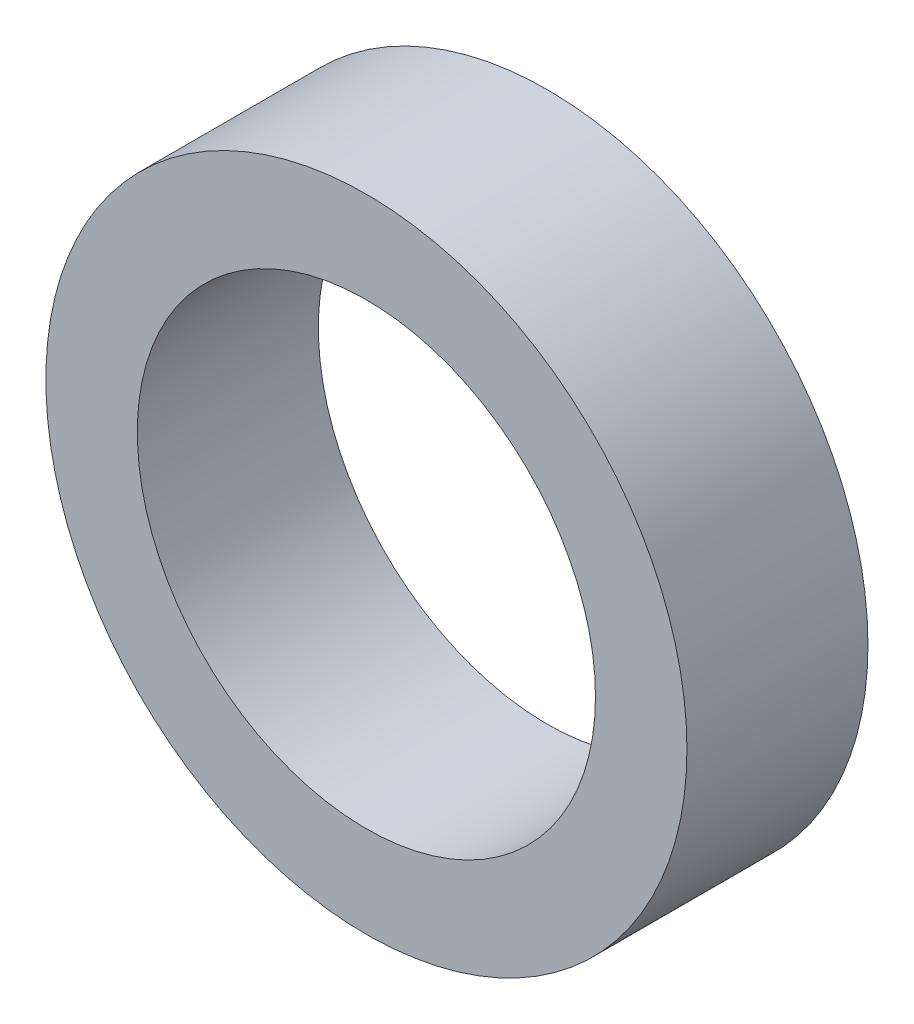
ISO-10303-21;
HEADER;
FILE_DESCRIPTION(('STEP AP214'),'2;1');
FILE_NAME('part.step','',(''),(''),'','','');
FILE_SCHEMA(('AUTOMOTIVE_DESIGN { 1 0 10303 214 1 1 1 1 }'));
ENDSEC;
DATA;
#1=APPLICATION_CONTEXT('core data for automotive mechanical design processes');
#2=APPLICATION_PROTOCOL_DEFINITION('international standard','automotive_design',2000,#1);
#3=PRODUCT_CONTEXT('',#1,'mechanical');
#4=PRODUCT('Part','Part','',(#3));
#5=PRODUCT_RELATED_PRODUCT_CATEGORY('part','',(#4));
#6=PRODUCT_DEFINITION_FORMATION('','',#4);
#7=PRODUCT_DEFINITION_CONTEXT('part definition',#1,'design');
#8=PRODUCT_DEFINITION('design','',#6,#7);
#9=PRODUCT_DEFINITION_SHAPE('','',#8);
#10=(LENGTH_UNIT() NAMED_UNIT(*) SI_UNIT(.MILLI.,.METRE.));
#11=(NAMED_UNIT(*) PLANE_ANGLE_UNIT() SI_UNIT($,.RADIAN.));
#12=(NAMED_UNIT(*) SI_UNIT($,.STERADIAN.) SOLID_ANGLE_UNIT());
#13=UNCERTAINTY_MEASURE_WITH_UNIT(LENGTH_MEASURE(1.E-05),#10,'distance_accuracy_value','');
#14=(GEOMETRIC_REPRESENTATION_CONTEXT(3) GLOBAL_UNCERTAINTY_ASSIGNED_CONTEXT((#13)) GLOBAL_UNIT_ASSIGNED_CONTEXT((#10,
#11,#12)) REPRESENTATION_CONTEXT('',''));
#15=CARTESIAN_POINT('',(0.,0.,0.));
#16=DIRECTION('',(0.,0.,1.));
#17=DIRECTION('',(1.,0.,0.));
#18=AXIS2_PLACEMENT_3D('',#15,#16,#17);
#19=CARTESIAN_POINT('',(0.,0.,4.8));
#20=DIRECTION('',(0.,0.,1.));
#21=DIRECTION('',(1.,0.,0.));
#22=AXIS2_PLACEMENT_3D('',#19,#20,#21);
#23=PLANE('',#22);
#24=CARTESIAN_POINT('',(0.,0.,4.8));
#25=DIRECTION('',(0.,0.,1.));
#26=DIRECTION('',(1.,0.,0.));
#27=AXIS2_PLACEMENT_3D('',#24,#25,#26);
#28=CIRCLE('',#27,8.5);
#29=CARTESIAN_POINT('',(8.5,0.,4.8));
#30=VERTEX_POINT('',#29);
#31=EDGE_CURVE('E10',#30,#30,#28,.T.);
#32=ORIENTED_EDGE('',*,*,#31,.T.);
#33=EDGE_LOOP('',(#32));
#34=FACE_BOUND('',#33,.T.);
#35=CARTESIAN_POINT('',(0.,0.,4.8));
#36=DIRECTION('',(0.,0.,1.));
#37=DIRECTION('',(1.,0.,0.));
#38=AXIS2_PLACEMENT_3D('',#35,#36,#37);
#39=CIRCLE('',#38,6.075);
#40=CARTESIAN_POINT('',(6.075,0.,4.8));
#41=VERTEX_POINT('',#40);
#42=EDGE_CURVE('E48',#41,#41,#39,.T.);
#43=ORIENTED_EDGE('',*,*,#42,.F.);
#44=EDGE_LOOP('',(#43));
#45=FACE_BOUND('',#44,.T.);
#46=ADVANCED_FACE('F40',(#34,#45),#23,.T.);
#47=CARTESIAN_POINT('',(0.,0.,0.));
#48=DIRECTION('',(0.,0.,1.));
#49=DIRECTION('',(1.,0.,0.));
#50=AXIS2_PLACEMENT_3D('',#47,#48,#49);
#51=PLANE('',#50);
#52=CARTESIAN_POINT('',(0.,0.,0.));
#53=DIRECTION('',(0.,0.,1.));
#54=DIRECTION('',(1.,0.,0.));
#55=AXIS2_PLACEMENT_3D('',#52,#53,#54);
#56=CIRCLE('',#55,8.5);
#57=CARTESIAN_POINT('',(8.5,0.,0.));
#58=VERTEX_POINT('',#57);
#59=EDGE_CURVE('E41',#58,#58,#56,.T.);
#60=ORIENTED_EDGE('',*,*,#59,.F.);
#61=EDGE_LOOP('',(#60));
#62=FACE_BOUND('',#61,.T.);
#63=CARTESIAN_POINT('',(0.,0.,0.));
#64=DIRECTION('',(0.,0.,1.));
#65=DIRECTION('',(1.,0.,0.));
#66=AXIS2_PLACEMENT_3D('',#63,#64,#65);
#67=CIRCLE('',#66,6.075);
#68=CARTESIAN_POINT('',(6.075,0.,0.));
#69=VERTEX_POINT('',#68);
#70=EDGE_CURVE('E49',#69,#69,#67,.T.);
#71=ORIENTED_EDGE('',*,*,#70,.T.);
#72=EDGE_LOOP('',(#71));
#73=FACE_BOUND('',#72,.T.);
#74=ADVANCED_FACE('F58',(#62,#73),#51,.F.);
#75=CARTESIAN_POINT('',(0.,0.,4.8));
#76=DIRECTION('',(0.,0.,-1.));
#77=DIRECTION('',(-1.,0.,0.));
#78=AXIS2_PLACEMENT_3D('',#75,#76,#77);
#79=CYLINDRICAL_SURFACE('',#78,8.5);
#80=ORIENTED_EDGE('',*,*,#31,.F.);
#81=EDGE_LOOP('',(#80));
#82=FACE_BOUND('',#81,.T.);
#83=ORIENTED_EDGE('',*,*,#59,.T.);
#84=EDGE_LOOP('',(#83));
#85=FACE_BOUND('',#84,.T.);
#86=ADVANCED_FACE('F39',(#82,#85),#79,.T.);
#87=CARTESIAN_POINT('',(0.,0.,4.8));
#88=DIRECTION('',(0.,0.,-1.));
#89=DIRECTION('',(-1.,0.,0.));
#90=AXIS2_PLACEMENT_3D('',#87,#88,#89);
#91=CYLINDRICAL_SURFACE('',#90,6.075);
#92=ORIENTED_EDGE('',*,*,#42,.T.);
#93=EDGE_LOOP('',(#92));
#94=FACE_BOUND('',#93,.T.);
#95=ORIENTED_EDGE('',*,*,#70,.F.);
#96=EDGE_LOOP('',(#95));
#97=FACE_BOUND('',#96,.T.);
#98=ADVANCED_FACE('F57',(#94,#97),#91,.F.);
#99=CLOSED_SHELL('',(#46,#74,#86,#98));
#100=MANIFOLD_SOLID_BREP('B2',#99);
#101=ADVANCED_BREP_SHAPE_REPRESENTATION('',(#18,#100),#14);
#102=SHAPE_DEFINITION_REPRESENTATION(#9,#101);
ENDSEC;
END-ISO-10303-21;
